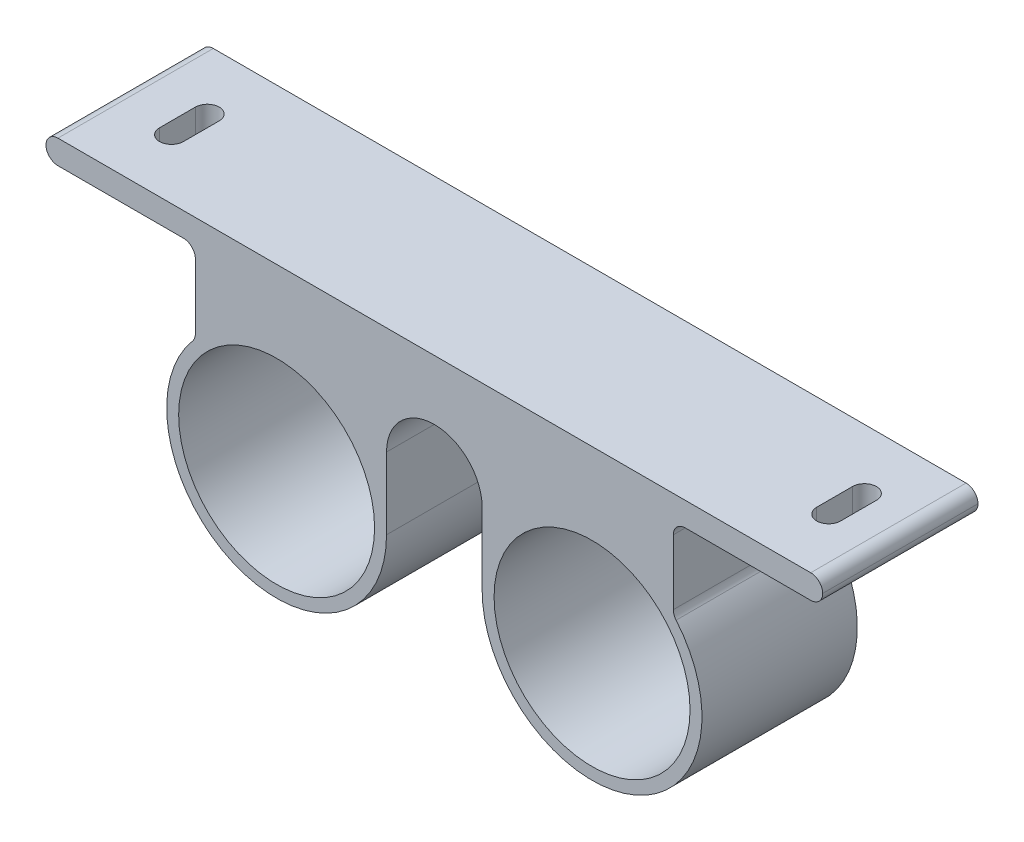
ISO-10303-21;
HEADER;
FILE_DESCRIPTION(('STEP AP214'),'2;1');
FILE_NAME('part.step','',(''),(''),'','','');
FILE_SCHEMA(('AUTOMOTIVE_DESIGN { 1 0 10303 214 1 1 1 1 }'));
ENDSEC;
DATA;
#1=APPLICATION_CONTEXT('core data for automotive mechanical design processes');
#2=APPLICATION_PROTOCOL_DEFINITION('international standard','automotive_design',2000,#1);
#3=PRODUCT_CONTEXT('',#1,'mechanical');
#4=PRODUCT('Part','Part','',(#3));
#5=PRODUCT_RELATED_PRODUCT_CATEGORY('part','',(#4));
#6=PRODUCT_DEFINITION_FORMATION('','',#4);
#7=PRODUCT_DEFINITION_CONTEXT('part definition',#1,'design');
#8=PRODUCT_DEFINITION('design','',#6,#7);
#9=PRODUCT_DEFINITION_SHAPE('','',#8);
#10=(LENGTH_UNIT() NAMED_UNIT(*) SI_UNIT(.MILLI.,.METRE.));
#11=(NAMED_UNIT(*) PLANE_ANGLE_UNIT() SI_UNIT($,.RADIAN.));
#12=(NAMED_UNIT(*) SI_UNIT($,.STERADIAN.) SOLID_ANGLE_UNIT());
#13=UNCERTAINTY_MEASURE_WITH_UNIT(LENGTH_MEASURE(1.E-05),#10,'distance_accuracy_value','');
#14=(GEOMETRIC_REPRESENTATION_CONTEXT(3) GLOBAL_UNCERTAINTY_ASSIGNED_CONTEXT((#13)) GLOBAL_UNIT_ASSIGNED_CONTEXT((#10,
#11,#12)) REPRESENTATION_CONTEXT('',''));
#15=CARTESIAN_POINT('',(0.,0.,0.));
#16=DIRECTION('',(0.,0.,1.));
#17=DIRECTION('',(1.,0.,0.));
#18=AXIS2_PLACEMENT_3D('',#15,#16,#17);
#19=CARTESIAN_POINT('',(9.3,10.,13.));
#20=DIRECTION('',(0.,0.,1.));
#21=DIRECTION('',(1.,0.,0.));
#22=AXIS2_PLACEMENT_3D('',#19,#20,#21);
#23=PLANE('',#22);
#24=CARTESIAN_POINT('',(35.7,10.,13.));
#25=DIRECTION('',(0.,0.,1.));
#26=DIRECTION('',(1.,0.,0.));
#27=AXIS2_PLACEMENT_3D('',#24,#25,#26);
#28=CIRCLE('',#27,8.2);
#29=CARTESIAN_POINT('',(27.5,10.,13.));
#30=VERTEX_POINT('',#29);
#31=EDGE_CURVE('E329',#30,#30,#28,.T.);
#32=ORIENTED_EDGE('',*,*,#31,.F.);
#33=EDGE_LOOP('',(#32));
#34=FACE_BOUND('',#33,.T.);
#35=DIRECTION('',(1.,0.,0.));
#36=VECTOR('',#35,1.);
#37=CARTESIAN_POINT('',(55.,23.,13.));
#38=LINE('',#37,#36);
#39=CARTESIAN_POINT('',(43.5,23.,13.));
#40=VERTEX_POINT('',#39);
#41=CARTESIAN_POINT('',(54.,23.,13.));
#42=VERTEX_POINT('',#41);
#43=EDGE_CURVE('E358',#40,#42,#38,.T.);
#44=ORIENTED_EDGE('',*,*,#43,.T.);
#45=CARTESIAN_POINT('',(54.,24.,13.));
#46=DIRECTION('',(0.,0.,1.));
#47=DIRECTION('',(1.,0.,0.));
#48=AXIS2_PLACEMENT_3D('',#45,#46,#47);
#49=CIRCLE('',#48,1.);
#50=CARTESIAN_POINT('',(55.,24.,13.));
#51=VERTEX_POINT('',#50);
#52=EDGE_CURVE('E457',#42,#51,#49,.T.);
#53=ORIENTED_EDGE('',*,*,#52,.T.);
#54=CARTESIAN_POINT('',(54.,24.,13.));
#55=DIRECTION('',(0.,0.,1.));
#56=DIRECTION('',(1.,0.,0.));
#57=AXIS2_PLACEMENT_3D('',#54,#55,#56);
#58=CIRCLE('',#57,1.);
#59=CARTESIAN_POINT('',(54.,25.,13.));
#60=VERTEX_POINT('',#59);
#61=EDGE_CURVE('E454',#51,#60,#58,.T.);
#62=ORIENTED_EDGE('',*,*,#61,.T.);
#63=DIRECTION('',(-1.,0.,0.));
#64=VECTOR('',#63,1.);
#65=CARTESIAN_POINT('',(55.,25.,13.));
#66=LINE('',#65,#64);
#67=CARTESIAN_POINT('',(-9.00000000000001,25.,13.));
#68=VERTEX_POINT('',#67);
#69=EDGE_CURVE('E362',#60,#68,#66,.T.);
#70=ORIENTED_EDGE('',*,*,#69,.T.);
#71=CARTESIAN_POINT('',(-9.,24.,13.));
#72=DIRECTION('',(0.,0.,1.));
#73=DIRECTION('',(1.,0.,0.));
#74=AXIS2_PLACEMENT_3D('',#71,#72,#73);
#75=CIRCLE('',#74,1.);
#76=CARTESIAN_POINT('',(-10.,24.,13.));
#77=VERTEX_POINT('',#76);
#78=EDGE_CURVE('E448',#68,#77,#75,.T.);
#79=ORIENTED_EDGE('',*,*,#78,.T.);
#80=CARTESIAN_POINT('',(-9.,24.,13.));
#81=DIRECTION('',(0.,0.,1.));
#82=DIRECTION('',(1.,0.,0.));
#83=AXIS2_PLACEMENT_3D('',#80,#81,#82);
#84=CIRCLE('',#83,1.);
#85=CARTESIAN_POINT('',(-9.,23.,13.));
#86=VERTEX_POINT('',#85);
#87=EDGE_CURVE('E451',#77,#86,#84,.T.);
#88=ORIENTED_EDGE('',*,*,#87,.T.);
#89=DIRECTION('',(1.,0.,0.));
#90=VECTOR('',#89,1.);
#91=CARTESIAN_POINT('',(-10.,23.,13.));
#92=LINE('',#91,#90);
#93=CARTESIAN_POINT('',(1.49999999999999,23.,13.));
#94=VERTEX_POINT('',#93);
#95=EDGE_CURVE('E366',#86,#94,#92,.T.);
#96=ORIENTED_EDGE('',*,*,#95,.T.);
#97=CARTESIAN_POINT('',(1.49999999999999,22.,13.));
#98=DIRECTION('',(0.,0.,1.));
#99=DIRECTION('',(1.,0.,0.));
#100=AXIS2_PLACEMENT_3D('',#97,#98,#99);
#101=CIRCLE('',#100,1.);
#102=CARTESIAN_POINT('',(2.49999999999999,22.,13.));
#103=VERTEX_POINT('',#102);
#104=EDGE_CURVE('E70',#94,#103,#101,.F.);
#105=ORIENTED_EDGE('',*,*,#104,.T.);
#106=DIRECTION('',(0.,-1.,0.));
#107=VECTOR('',#106,1.);
#108=CARTESIAN_POINT('',(2.49999999999999,23.,13.));
#109=LINE('',#108,#107);
#110=CARTESIAN_POINT('',(2.49999999999999,16.572670690062,13.));
#111=VERTEX_POINT('',#110);
#112=EDGE_CURVE('E369',#103,#111,#109,.T.);
#113=ORIENTED_EDGE('',*,*,#112,.T.);
#114=CARTESIAN_POINT('',(1.49999999999999,16.572670690062,13.));
#115=DIRECTION('',(0.,0.,1.));
#116=DIRECTION('',(1.,0.,0.));
#117=AXIS2_PLACEMENT_3D('',#114,#115,#116);
#118=CIRCLE('',#117,1.);
#119=CARTESIAN_POINT('',(2.26470588235294,15.9282912106441,13.));
#120=VERTEX_POINT('',#119);
#121=EDGE_CURVE('E11',#111,#120,#118,.F.);
#122=ORIENTED_EDGE('',*,*,#121,.T.);
#123=CARTESIAN_POINT('',(9.3,10.,13.));
#124=DIRECTION('',(0.,0.,1.));
#125=DIRECTION('',(1.,0.,0.));
#126=AXIS2_PLACEMENT_3D('',#123,#124,#125);
#127=CIRCLE('',#126,9.2);
#128=CARTESIAN_POINT('',(18.5,10.,13.));
#129=VERTEX_POINT('',#128);
#130=EDGE_CURVE('E337',#120,#129,#127,.T.);
#131=ORIENTED_EDGE('',*,*,#130,.T.);
#132=DIRECTION('',(0.,1.,0.));
#133=VECTOR('',#132,1.);
#134=CARTESIAN_POINT('',(18.5,10.,13.));
#135=LINE('',#134,#133);
#136=CARTESIAN_POINT('',(18.5,16.,13.));
#137=VERTEX_POINT('',#136);
#138=EDGE_CURVE('E340',#129,#137,#135,.T.);
#139=ORIENTED_EDGE('',*,*,#138,.T.);
#140=CARTESIAN_POINT('',(22.5,16.,13.));
#141=DIRECTION('',(0.,0.,-1.));
#142=DIRECTION('',(1.,0.,0.));
#143=AXIS2_PLACEMENT_3D('',#140,#141,#142);
#144=CIRCLE('',#143,4.);
#145=CARTESIAN_POINT('',(26.5,16.,13.));
#146=VERTEX_POINT('',#145);
#147=EDGE_CURVE('E344',#137,#146,#144,.T.);
#148=ORIENTED_EDGE('',*,*,#147,.T.);
#149=DIRECTION('',(0.,-1.,0.));
#150=VECTOR('',#149,1.);
#151=CARTESIAN_POINT('',(26.5,16.,13.));
#152=LINE('',#151,#150);
#153=CARTESIAN_POINT('',(26.5,10.,13.));
#154=VERTEX_POINT('',#153);
#155=EDGE_CURVE('E347',#146,#154,#152,.T.);
#156=ORIENTED_EDGE('',*,*,#155,.T.);
#157=CARTESIAN_POINT('',(35.7,10.,13.));
#158=DIRECTION('',(0.,0.,1.));
#159=DIRECTION('',(1.,0.,0.));
#160=AXIS2_PLACEMENT_3D('',#157,#158,#159);
#161=CIRCLE('',#160,9.19999999999999);
#162=CARTESIAN_POINT('',(42.7352941176471,15.9282912106441,13.));
#163=VERTEX_POINT('',#162);
#164=EDGE_CURVE('E350',#154,#163,#161,.T.);
#165=ORIENTED_EDGE('',*,*,#164,.T.);
#166=CARTESIAN_POINT('',(43.5,16.572670690062,13.));
#167=DIRECTION('',(0.,0.,1.));
#168=DIRECTION('',(1.,0.,0.));
#169=AXIS2_PLACEMENT_3D('',#166,#167,#168);
#170=CIRCLE('',#169,1.);
#171=CARTESIAN_POINT('',(42.5,16.572670690062,13.));
#172=VERTEX_POINT('',#171);
#173=EDGE_CURVE('E500',#163,#172,#170,.F.);
#174=ORIENTED_EDGE('',*,*,#173,.T.);
#175=DIRECTION('',(0.,1.,0.));
#176=VECTOR('',#175,1.);
#177=CARTESIAN_POINT('',(42.5,23.,13.));
#178=LINE('',#177,#176);
#179=CARTESIAN_POINT('',(42.5,22.,13.));
#180=VERTEX_POINT('',#179);
#181=EDGE_CURVE('E354',#172,#180,#178,.T.);
#182=ORIENTED_EDGE('',*,*,#181,.T.);
#183=CARTESIAN_POINT('',(43.5,22.,13.));
#184=DIRECTION('',(0.,0.,1.));
#185=DIRECTION('',(1.,0.,0.));
#186=AXIS2_PLACEMENT_3D('',#183,#184,#185);
#187=CIRCLE('',#186,1.);
#188=EDGE_CURVE('E489',#180,#40,#187,.F.);
#189=ORIENTED_EDGE('',*,*,#188,.T.);
#190=EDGE_LOOP('',(#44,#53,#62,#70,#79,#88,#96,#105,#113,#122,#131,#139,#148,#156,#165,#174,
#182,#189));
#191=FACE_BOUND('',#190,.T.);
#192=CARTESIAN_POINT('',(9.3,10.,13.));
#193=DIRECTION('',(0.,0.,1.));
#194=DIRECTION('',(1.,0.,0.));
#195=AXIS2_PLACEMENT_3D('',#192,#193,#194);
#196=CIRCLE('',#195,8.2);
#197=CARTESIAN_POINT('',(1.1,10.,13.));
#198=VERTEX_POINT('',#197);
#199=EDGE_CURVE('E321',#198,#198,#196,.T.);
#200=ORIENTED_EDGE('',*,*,#199,.F.);
#201=EDGE_LOOP('',(#200));
#202=FACE_BOUND('',#201,.T.);
#203=ADVANCED_FACE('F45',(#34,#191,#202),#23,.T.);
#204=CARTESIAN_POINT('',(9.3,10.,0.));
#205=DIRECTION('',(0.,0.,1.));
#206=DIRECTION('',(1.,0.,0.));
#207=AXIS2_PLACEMENT_3D('',#204,#205,#206);
#208=PLANE('',#207);
#209=CARTESIAN_POINT('',(54.,24.,0.));
#210=DIRECTION('',(0.,0.,1.));
#211=DIRECTION('',(1.,0.,0.));
#212=AXIS2_PLACEMENT_3D('',#209,#210,#211);
#213=CIRCLE('',#212,1.);
#214=CARTESIAN_POINT('',(54.,25.,0.));
#215=VERTEX_POINT('',#214);
#216=CARTESIAN_POINT('',(55.,24.,0.));
#217=VERTEX_POINT('',#216);
#218=EDGE_CURVE('E442',#215,#217,#213,.F.);
#219=ORIENTED_EDGE('',*,*,#218,.T.);
#220=CARTESIAN_POINT('',(54.,24.,0.));
#221=DIRECTION('',(0.,0.,1.));
#222=DIRECTION('',(1.,0.,0.));
#223=AXIS2_PLACEMENT_3D('',#220,#221,#222);
#224=CIRCLE('',#223,1.);
#225=CARTESIAN_POINT('',(54.,23.,0.));
#226=VERTEX_POINT('',#225);
#227=EDGE_CURVE('E445',#217,#226,#224,.F.);
#228=ORIENTED_EDGE('',*,*,#227,.T.);
#229=DIRECTION('',(1.,0.,0.));
#230=VECTOR('',#229,1.);
#231=CARTESIAN_POINT('',(55.,23.,0.));
#232=LINE('',#231,#230);
#233=CARTESIAN_POINT('',(43.5,23.,0.));
#234=VERTEX_POINT('',#233);
#235=EDGE_CURVE('E392',#234,#226,#232,.T.);
#236=ORIENTED_EDGE('',*,*,#235,.F.);
#237=CARTESIAN_POINT('',(43.5,22.,0.));
#238=DIRECTION('',(0.,0.,1.));
#239=DIRECTION('',(1.,0.,0.));
#240=AXIS2_PLACEMENT_3D('',#237,#238,#239);
#241=CIRCLE('',#240,1.);
#242=CARTESIAN_POINT('',(42.5,22.,0.));
#243=VERTEX_POINT('',#242);
#244=EDGE_CURVE('E486',#234,#243,#241,.T.);
#245=ORIENTED_EDGE('',*,*,#244,.T.);
#246=DIRECTION('',(0.,1.,0.));
#247=VECTOR('',#246,1.);
#248=CARTESIAN_POINT('',(42.5,23.,0.));
#249=LINE('',#248,#247);
#250=CARTESIAN_POINT('',(42.5,16.572670690062,0.));
#251=VERTEX_POINT('',#250);
#252=EDGE_CURVE('E388',#251,#243,#249,.T.);
#253=ORIENTED_EDGE('',*,*,#252,.F.);
#254=CARTESIAN_POINT('',(43.5,16.572670690062,0.));
#255=DIRECTION('',(0.,0.,1.));
#256=DIRECTION('',(1.,0.,0.));
#257=AXIS2_PLACEMENT_3D('',#254,#255,#256);
#258=CIRCLE('',#257,1.);
#259=CARTESIAN_POINT('',(42.7352941176471,15.9282912106441,0.));
#260=VERTEX_POINT('',#259);
#261=EDGE_CURVE('E497',#251,#260,#258,.T.);
#262=ORIENTED_EDGE('',*,*,#261,.T.);
#263=CARTESIAN_POINT('',(35.7,10.,0.));
#264=DIRECTION('',(0.,0.,1.));
#265=DIRECTION('',(1.,0.,0.));
#266=AXIS2_PLACEMENT_3D('',#263,#264,#265);
#267=CIRCLE('',#266,9.19999999999999);
#268=CARTESIAN_POINT('',(26.5,10.,0.));
#269=VERTEX_POINT('',#268);
#270=EDGE_CURVE('E384',#269,#260,#267,.T.);
#271=ORIENTED_EDGE('',*,*,#270,.F.);
#272=DIRECTION('',(0.,-1.,0.));
#273=VECTOR('',#272,1.);
#274=CARTESIAN_POINT('',(26.5,16.,0.));
#275=LINE('',#274,#273);
#276=CARTESIAN_POINT('',(26.5,16.,0.));
#277=VERTEX_POINT('',#276);
#278=EDGE_CURVE('E381',#277,#269,#275,.T.);
#279=ORIENTED_EDGE('',*,*,#278,.F.);
#280=CARTESIAN_POINT('',(22.5,16.,0.));
#281=DIRECTION('',(0.,0.,-1.));
#282=DIRECTION('',(1.,0.,0.));
#283=AXIS2_PLACEMENT_3D('',#280,#281,#282);
#284=CIRCLE('',#283,4.);
#285=CARTESIAN_POINT('',(18.5,16.,0.));
#286=VERTEX_POINT('',#285);
#287=EDGE_CURVE('E378',#286,#277,#284,.T.);
#288=ORIENTED_EDGE('',*,*,#287,.F.);
#289=DIRECTION('',(0.,1.,0.));
#290=VECTOR('',#289,1.);
#291=CARTESIAN_POINT('',(18.5,10.,0.));
#292=LINE('',#291,#290);
#293=CARTESIAN_POINT('',(18.5,10.,0.));
#294=VERTEX_POINT('',#293);
#295=EDGE_CURVE('E375',#294,#286,#292,.T.);
#296=ORIENTED_EDGE('',*,*,#295,.F.);
#297=CARTESIAN_POINT('',(9.3,10.,0.));
#298=DIRECTION('',(0.,0.,1.));
#299=DIRECTION('',(1.,0.,0.));
#300=AXIS2_PLACEMENT_3D('',#297,#298,#299);
#301=CIRCLE('',#300,9.2);
#302=CARTESIAN_POINT('',(2.26470588235294,15.9282912106441,0.));
#303=VERTEX_POINT('',#302);
#304=EDGE_CURVE('E333',#303,#294,#301,.T.);
#305=ORIENTED_EDGE('',*,*,#304,.F.);
#306=CARTESIAN_POINT('',(1.49999999999999,16.572670690062,0.));
#307=DIRECTION('',(0.,0.,1.));
#308=DIRECTION('',(1.,0.,0.));
#309=AXIS2_PLACEMENT_3D('',#306,#307,#308);
#310=CIRCLE('',#309,1.);
#311=CARTESIAN_POINT('',(2.49999999999999,16.572670690062,0.));
#312=VERTEX_POINT('',#311);
#313=EDGE_CURVE('E55',#303,#312,#310,.T.);
#314=ORIENTED_EDGE('',*,*,#313,.T.);
#315=DIRECTION('',(0.,-1.,0.));
#316=VECTOR('',#315,1.);
#317=CARTESIAN_POINT('',(2.49999999999999,23.,0.));
#318=LINE('',#317,#316);
#319=CARTESIAN_POINT('',(2.49999999999999,22.,0.));
#320=VERTEX_POINT('',#319);
#321=EDGE_CURVE('E341',#320,#312,#318,.T.);
#322=ORIENTED_EDGE('',*,*,#321,.F.);
#323=CARTESIAN_POINT('',(1.49999999999999,22.,0.));
#324=DIRECTION('',(0.,0.,1.));
#325=DIRECTION('',(1.,0.,0.));
#326=AXIS2_PLACEMENT_3D('',#323,#324,#325);
#327=CIRCLE('',#326,1.);
#328=CARTESIAN_POINT('',(1.49999999999999,23.,0.));
#329=VERTEX_POINT('',#328);
#330=EDGE_CURVE('E492',#320,#329,#327,.T.);
#331=ORIENTED_EDGE('',*,*,#330,.T.);
#332=DIRECTION('',(1.,0.,0.));
#333=VECTOR('',#332,1.);
#334=CARTESIAN_POINT('',(-10.,23.,0.));
#335=LINE('',#334,#333);
#336=CARTESIAN_POINT('',(-9.,23.,0.));
#337=VERTEX_POINT('',#336);
#338=EDGE_CURVE('E400',#337,#329,#335,.T.);
#339=ORIENTED_EDGE('',*,*,#338,.F.);
#340=CARTESIAN_POINT('',(-9.,24.,0.));
#341=DIRECTION('',(0.,0.,1.));
#342=DIRECTION('',(1.,0.,0.));
#343=AXIS2_PLACEMENT_3D('',#340,#341,#342);
#344=CIRCLE('',#343,1.);
#345=CARTESIAN_POINT('',(-10.,24.,0.));
#346=VERTEX_POINT('',#345);
#347=EDGE_CURVE('E439',#337,#346,#344,.F.);
#348=ORIENTED_EDGE('',*,*,#347,.T.);
#349=CARTESIAN_POINT('',(-9.,24.,0.));
#350=DIRECTION('',(0.,0.,1.));
#351=DIRECTION('',(1.,0.,0.));
#352=AXIS2_PLACEMENT_3D('',#349,#350,#351);
#353=CIRCLE('',#352,1.);
#354=CARTESIAN_POINT('',(-9.00000000000001,25.,0.));
#355=VERTEX_POINT('',#354);
#356=EDGE_CURVE('E436',#346,#355,#353,.F.);
#357=ORIENTED_EDGE('',*,*,#356,.T.);
#358=DIRECTION('',(-1.,0.,0.));
#359=VECTOR('',#358,1.);
#360=CARTESIAN_POINT('',(55.,25.,0.));
#361=LINE('',#360,#359);
#362=EDGE_CURVE('E396',#215,#355,#361,.T.);
#363=ORIENTED_EDGE('',*,*,#362,.F.);
#364=EDGE_LOOP('',(#219,#228,#236,#245,#253,#262,#271,#279,#288,#296,#305,#314,#322,#331,#339,
#348,#357,#363));
#365=FACE_BOUND('',#364,.T.);
#366=CARTESIAN_POINT('',(35.7,10.,0.));
#367=DIRECTION('',(0.,0.,1.));
#368=DIRECTION('',(1.,0.,0.));
#369=AXIS2_PLACEMENT_3D('',#366,#367,#368);
#370=CIRCLE('',#369,8.2);
#371=CARTESIAN_POINT('',(27.5,10.,0.));
#372=VERTEX_POINT('',#371);
#373=EDGE_CURVE('E325',#372,#372,#370,.T.);
#374=ORIENTED_EDGE('',*,*,#373,.T.);
#375=EDGE_LOOP('',(#374));
#376=FACE_BOUND('',#375,.T.);
#377=CARTESIAN_POINT('',(9.3,10.,0.));
#378=DIRECTION('',(0.,0.,1.));
#379=DIRECTION('',(1.,0.,0.));
#380=AXIS2_PLACEMENT_3D('',#377,#378,#379);
#381=CIRCLE('',#380,8.2);
#382=CARTESIAN_POINT('',(1.1,10.,0.));
#383=VERTEX_POINT('',#382);
#384=EDGE_CURVE('E244',#383,#383,#381,.T.);
#385=ORIENTED_EDGE('',*,*,#384,.T.);
#386=EDGE_LOOP('',(#385));
#387=FACE_BOUND('',#386,.T.);
#388=ADVANCED_FACE('F523',(#365,#376,#387),#208,.F.);
#389=CARTESIAN_POINT('',(9.3,10.,13.));
#390=DIRECTION('',(0.,0.,-1.));
#391=DIRECTION('',(-1.,0.,0.));
#392=AXIS2_PLACEMENT_3D('',#389,#390,#391);
#393=CYLINDRICAL_SURFACE('',#392,9.2);
#394=ORIENTED_EDGE('',*,*,#130,.F.);
#395=DIRECTION('',(0.,0.,-1.));
#396=VECTOR('',#395,1.);
#397=CARTESIAN_POINT('',(2.26470588235294,15.9282912106441,13.));
#398=LINE('',#397,#396);
#399=EDGE_CURVE('E482',#120,#303,#398,.T.);
#400=ORIENTED_EDGE('',*,*,#399,.T.);
#401=ORIENTED_EDGE('',*,*,#304,.T.);
#402=DIRECTION('',(0.,0.,-1.));
#403=VECTOR('',#402,1.);
#404=CARTESIAN_POINT('',(18.5,10.,13.));
#405=LINE('',#404,#403);
#406=EDGE_CURVE('E417',#129,#294,#405,.T.);
#407=ORIENTED_EDGE('',*,*,#406,.F.);
#408=EDGE_LOOP('',(#394,#400,#401,#407));
#409=FACE_BOUND('',#408,.T.);
#410=ADVANCED_FACE('F578',(#409),#393,.T.);
#411=CARTESIAN_POINT('',(18.5,10.,13.));
#412=DIRECTION('',(-1.,0.,0.));
#413=DIRECTION('',(0.,0.,1.));
#414=AXIS2_PLACEMENT_3D('',#411,#412,#413);
#415=PLANE('',#414);
#416=ORIENTED_EDGE('',*,*,#295,.T.);
#417=DIRECTION('',(0.,0.,-1.));
#418=VECTOR('',#417,1.);
#419=CARTESIAN_POINT('',(18.5,16.,13.));
#420=LINE('',#419,#418);
#421=EDGE_CURVE('E413',#137,#286,#420,.T.);
#422=ORIENTED_EDGE('',*,*,#421,.F.);
#423=ORIENTED_EDGE('',*,*,#138,.F.);
#424=ORIENTED_EDGE('',*,*,#406,.T.);
#425=EDGE_LOOP('',(#416,#422,#423,#424));
#426=FACE_BOUND('',#425,.T.);
#427=ADVANCED_FACE('F574',(#426),#415,.F.);
#428=CARTESIAN_POINT('',(22.5,16.,13.));
#429=DIRECTION('',(0.,0.,-1.));
#430=DIRECTION('',(-1.,0.,0.));
#431=AXIS2_PLACEMENT_3D('',#428,#429,#430);
#432=CYLINDRICAL_SURFACE('',#431,4.);
#433=ORIENTED_EDGE('',*,*,#287,.T.);
#434=DIRECTION('',(0.,0.,-1.));
#435=VECTOR('',#434,1.);
#436=CARTESIAN_POINT('',(26.5,16.,13.));
#437=LINE('',#436,#435);
#438=EDGE_CURVE('E409',#146,#277,#437,.T.);
#439=ORIENTED_EDGE('',*,*,#438,.F.);
#440=ORIENTED_EDGE('',*,*,#147,.F.);
#441=ORIENTED_EDGE('',*,*,#421,.T.);
#442=EDGE_LOOP('',(#433,#439,#440,#441));
#443=FACE_BOUND('',#442,.T.);
#444=ADVANCED_FACE('F569',(#443),#432,.F.);
#445=CARTESIAN_POINT('',(26.5,16.,13.));
#446=DIRECTION('',(1.,0.,0.));
#447=DIRECTION('',(0.,1.,0.));
#448=AXIS2_PLACEMENT_3D('',#445,#446,#447);
#449=PLANE('',#448);
#450=ORIENTED_EDGE('',*,*,#278,.T.);
#451=DIRECTION('',(0.,0.,-1.));
#452=VECTOR('',#451,1.);
#453=CARTESIAN_POINT('',(26.5,10.,13.));
#454=LINE('',#453,#452);
#455=EDGE_CURVE('E372',#154,#269,#454,.T.);
#456=ORIENTED_EDGE('',*,*,#455,.F.);
#457=ORIENTED_EDGE('',*,*,#155,.F.);
#458=ORIENTED_EDGE('',*,*,#438,.T.);
#459=EDGE_LOOP('',(#450,#456,#457,#458));
#460=FACE_BOUND('',#459,.T.);
#461=ADVANCED_FACE('F563',(#460),#449,.F.);
#462=CARTESIAN_POINT('',(35.7,10.,13.));
#463=DIRECTION('',(0.,0.,-1.));
#464=DIRECTION('',(-1.,0.,0.));
#465=AXIS2_PLACEMENT_3D('',#462,#463,#464);
#466=CYLINDRICAL_SURFACE('',#465,9.19999999999999);
#467=ORIENTED_EDGE('',*,*,#270,.T.);
#468=DIRECTION('',(0.,0.,-1.));
#469=VECTOR('',#468,1.);
#470=CARTESIAN_POINT('',(42.7352941176471,15.9282912106441,13.));
#471=LINE('',#470,#469);
#472=EDGE_CURVE('E479',#260,#163,#471,.F.);
#473=ORIENTED_EDGE('',*,*,#472,.T.);
#474=ORIENTED_EDGE('',*,*,#164,.F.);
#475=ORIENTED_EDGE('',*,*,#455,.T.);
#476=EDGE_LOOP('',(#467,#473,#474,#475));
#477=FACE_BOUND('',#476,.T.);
#478=ADVANCED_FACE('F558',(#477),#466,.T.);
#479=CARTESIAN_POINT('',(42.5,23.,13.));
#480=DIRECTION('',(-1.,0.,0.));
#481=DIRECTION('',(0.,-1.,0.));
#482=AXIS2_PLACEMENT_3D('',#479,#480,#481);
#483=PLANE('',#482);
#484=ORIENTED_EDGE('',*,*,#252,.T.);
#485=DIRECTION('',(0.,0.,-1.));
#486=VECTOR('',#485,1.);
#487=CARTESIAN_POINT('',(42.5,22.,13.));
#488=LINE('',#487,#486);
#489=EDGE_CURVE('E433',#243,#180,#488,.F.);
#490=ORIENTED_EDGE('',*,*,#489,.T.);
#491=ORIENTED_EDGE('',*,*,#181,.F.);
#492=DIRECTION('',(0.,0.,1.));
#493=VECTOR('',#492,1.);
#494=CARTESIAN_POINT('',(42.5,16.572670690062,0.));
#495=LINE('',#494,#493);
#496=EDGE_CURVE('E429',#172,#251,#495,.F.);
#497=ORIENTED_EDGE('',*,*,#496,.T.);
#498=EDGE_LOOP('',(#484,#490,#491,#497));
#499=FACE_BOUND('',#498,.T.);
#500=ADVANCED_FACE('F548',(#499),#483,.F.);
#501=CARTESIAN_POINT('',(55.,23.,13.));
#502=DIRECTION('',(0.,1.,0.));
#503=DIRECTION('',(0.,0.,1.));
#504=AXIS2_PLACEMENT_3D('',#501,#502,#503);
#505=PLANE('',#504);
#506=DIRECTION('',(0.,0.,1.));
#507=VECTOR('',#506,1.);
#508=CARTESIAN_POINT('',(51.5,23.,5.));
#509=LINE('',#508,#507);
#510=CARTESIAN_POINT('',(51.5,23.,5.));
#511=VERTEX_POINT('',#510);
#512=CARTESIAN_POINT('',(51.5,23.,8.));
#513=VERTEX_POINT('',#512);
#514=EDGE_CURVE('E314',#511,#513,#509,.T.);
#515=ORIENTED_EDGE('',*,*,#514,.F.);
#516=CARTESIAN_POINT('',(50.5,23.,5.));
#517=DIRECTION('',(0.,1.,0.));
#518=DIRECTION('',(0.,0.,1.));
#519=AXIS2_PLACEMENT_3D('',#516,#517,#518);
#520=CIRCLE('',#519,1.);
#521=CARTESIAN_POINT('',(49.5,23.,5.));
#522=VERTEX_POINT('',#521);
#523=EDGE_CURVE('E310',#522,#511,#520,.F.);
#524=ORIENTED_EDGE('',*,*,#523,.F.);
#525=DIRECTION('',(0.,0.,-1.));
#526=VECTOR('',#525,1.);
#527=CARTESIAN_POINT('',(49.5,23.,5.));
#528=LINE('',#527,#526);
#529=CARTESIAN_POINT('',(49.5,23.,8.));
#530=VERTEX_POINT('',#529);
#531=EDGE_CURVE('E277',#530,#522,#528,.T.);
#532=ORIENTED_EDGE('',*,*,#531,.F.);
#533=CARTESIAN_POINT('',(50.5,23.,8.));
#534=DIRECTION('',(0.,1.,0.));
#535=DIRECTION('',(0.,0.,1.));
#536=AXIS2_PLACEMENT_3D('',#533,#534,#535);
#537=CIRCLE('',#536,1.);
#538=EDGE_CURVE('E318',#513,#530,#537,.F.);
#539=ORIENTED_EDGE('',*,*,#538,.F.);
#540=EDGE_LOOP('',(#515,#524,#532,#539));
#541=FACE_BOUND('',#540,.T.);
#542=ORIENTED_EDGE('',*,*,#43,.F.);
#543=DIRECTION('',(0.,0.,-1.));
#544=VECTOR('',#543,1.);
#545=CARTESIAN_POINT('',(43.5,23.,0.));
#546=LINE('',#545,#544);
#547=EDGE_CURVE('E425',#40,#234,#546,.T.);
#548=ORIENTED_EDGE('',*,*,#547,.T.);
#549=ORIENTED_EDGE('',*,*,#235,.T.);
#550=DIRECTION('',(0.,0.,-1.));
#551=VECTOR('',#550,1.);
#552=CARTESIAN_POINT('',(54.,23.,13.));
#553=LINE('',#552,#551);
#554=EDGE_CURVE('E421',#226,#42,#553,.F.);
#555=ORIENTED_EDGE('',*,*,#554,.T.);
#556=EDGE_LOOP('',(#542,#548,#549,#555));
#557=FACE_BOUND('',#556,.T.);
#558=ADVANCED_FACE('F538',(#541,#557),#505,.F.);
#559=CARTESIAN_POINT('',(55.,25.,13.));
#560=DIRECTION('',(0.,-1.,0.));
#561=DIRECTION('',(0.,0.,-1.));
#562=AXIS2_PLACEMENT_3D('',#559,#560,#561);
#563=PLANE('',#562);
#564=DIRECTION('',(0.,0.,1.));
#565=VECTOR('',#564,1.);
#566=CARTESIAN_POINT('',(-5.5,25.,5.));
#567=LINE('',#566,#565);
#568=CARTESIAN_POINT('',(-5.50000000000001,25.,5.));
#569=VERTEX_POINT('',#568);
#570=CARTESIAN_POINT('',(-5.5,25.,8.));
#571=VERTEX_POINT('',#570);
#572=EDGE_CURVE('E255',#569,#571,#567,.T.);
#573=ORIENTED_EDGE('',*,*,#572,.F.);
#574=CARTESIAN_POINT('',(-4.5,25.,5.));
#575=DIRECTION('',(0.,1.,0.));
#576=DIRECTION('',(0.,0.,1.));
#577=AXIS2_PLACEMENT_3D('',#574,#575,#576);
#578=CIRCLE('',#577,1.);
#579=CARTESIAN_POINT('',(-3.49999999999999,25.,5.));
#580=VERTEX_POINT('',#579);
#581=EDGE_CURVE('E229',#580,#569,#578,.T.);
#582=ORIENTED_EDGE('',*,*,#581,.F.);
#583=DIRECTION('',(0.,0.,-1.));
#584=VECTOR('',#583,1.);
#585=CARTESIAN_POINT('',(-3.49999999999999,25.,5.));
#586=LINE('',#585,#584);
#587=CARTESIAN_POINT('',(-3.49999999999999,25.,8.));
#588=VERTEX_POINT('',#587);
#589=EDGE_CURVE('E235',#588,#580,#586,.T.);
#590=ORIENTED_EDGE('',*,*,#589,.F.);
#591=CARTESIAN_POINT('',(-4.5,25.,8.));
#592=DIRECTION('',(0.,1.,0.));
#593=DIRECTION('',(0.,0.,1.));
#594=AXIS2_PLACEMENT_3D('',#591,#592,#593);
#595=CIRCLE('',#594,1.);
#596=EDGE_CURVE('E263',#571,#588,#595,.T.);
#597=ORIENTED_EDGE('',*,*,#596,.F.);
#598=EDGE_LOOP('',(#573,#582,#590,#597));
#599=FACE_BOUND('',#598,.T.);
#600=DIRECTION('',(0.,0.,1.));
#601=VECTOR('',#600,1.);
#602=CARTESIAN_POINT('',(49.5,25.,5.));
#603=LINE('',#602,#601);
#604=CARTESIAN_POINT('',(49.5,25.,5.));
#605=VERTEX_POINT('',#604);
#606=CARTESIAN_POINT('',(49.5,25.,8.));
#607=VERTEX_POINT('',#606);
#608=EDGE_CURVE('E303',#605,#607,#603,.T.);
#609=ORIENTED_EDGE('',*,*,#608,.F.);
#610=CARTESIAN_POINT('',(50.5,25.,5.));
#611=DIRECTION('',(0.,1.,0.));
#612=DIRECTION('',(0.,0.,1.));
#613=AXIS2_PLACEMENT_3D('',#610,#611,#612);
#614=CIRCLE('',#613,1.);
#615=CARTESIAN_POINT('',(51.5,25.,5.));
#616=VERTEX_POINT('',#615);
#617=EDGE_CURVE('E307',#616,#605,#614,.T.);
#618=ORIENTED_EDGE('',*,*,#617,.F.);
#619=DIRECTION('',(0.,0.,-1.));
#620=VECTOR('',#619,1.);
#621=CARTESIAN_POINT('',(51.5,25.,5.));
#622=LINE('',#621,#620);
#623=CARTESIAN_POINT('',(51.5,25.,8.));
#624=VERTEX_POINT('',#623);
#625=EDGE_CURVE('E287',#624,#616,#622,.T.);
#626=ORIENTED_EDGE('',*,*,#625,.F.);
#627=CARTESIAN_POINT('',(50.5,25.,8.));
#628=DIRECTION('',(0.,1.,0.));
#629=DIRECTION('',(0.,0.,1.));
#630=AXIS2_PLACEMENT_3D('',#627,#628,#629);
#631=CIRCLE('',#630,1.);
#632=EDGE_CURVE('E299',#607,#624,#631,.T.);
#633=ORIENTED_EDGE('',*,*,#632,.F.);
#634=EDGE_LOOP('',(#609,#618,#626,#633));
#635=FACE_BOUND('',#634,.T.);
#636=ORIENTED_EDGE('',*,*,#69,.F.);
#637=DIRECTION('',(0.,0.,-1.));
#638=VECTOR('',#637,1.);
#639=CARTESIAN_POINT('',(54.,25.,13.));
#640=LINE('',#639,#638);
#641=EDGE_CURVE('E476',#60,#215,#640,.T.);
#642=ORIENTED_EDGE('',*,*,#641,.T.);
#643=ORIENTED_EDGE('',*,*,#362,.T.);
#644=DIRECTION('',(0.,0.,-1.));
#645=VECTOR('',#644,1.);
#646=CARTESIAN_POINT('',(-9.00000000000001,25.,13.));
#647=LINE('',#646,#645);
#648=EDGE_CURVE('E473',#355,#68,#647,.F.);
#649=ORIENTED_EDGE('',*,*,#648,.T.);
#650=EDGE_LOOP('',(#636,#642,#643,#649));
#651=FACE_BOUND('',#650,.T.);
#652=ADVANCED_FACE('F529',(#599,#635,#651),#563,.F.);
#653=CARTESIAN_POINT('',(-10.,23.,13.));
#654=DIRECTION('',(0.,1.,0.));
#655=DIRECTION('',(0.,0.,1.));
#656=AXIS2_PLACEMENT_3D('',#653,#654,#655);
#657=PLANE('',#656);
#658=DIRECTION('',(0.,0.,1.));
#659=VECTOR('',#658,1.);
#660=CARTESIAN_POINT('',(-3.49999999999999,23.,5.));
#661=LINE('',#660,#659);
#662=CARTESIAN_POINT('',(-3.49999999999999,23.,5.));
#663=VERTEX_POINT('',#662);
#664=CARTESIAN_POINT('',(-3.49999999999999,23.,8.));
#665=VERTEX_POINT('',#664);
#666=EDGE_CURVE('E250',#663,#665,#661,.T.);
#667=ORIENTED_EDGE('',*,*,#666,.F.);
#668=CARTESIAN_POINT('',(-4.5,23.,5.));
#669=DIRECTION('',(0.,1.,0.));
#670=DIRECTION('',(0.,0.,1.));
#671=AXIS2_PLACEMENT_3D('',#668,#669,#670);
#672=CIRCLE('',#671,1.);
#673=CARTESIAN_POINT('',(-5.5,23.,5.));
#674=VERTEX_POINT('',#673);
#675=EDGE_CURVE('E226',#674,#663,#672,.F.);
#676=ORIENTED_EDGE('',*,*,#675,.F.);
#677=DIRECTION('',(0.,0.,-1.));
#678=VECTOR('',#677,1.);
#679=CARTESIAN_POINT('',(-5.5,23.,5.));
#680=LINE('',#679,#678);
#681=CARTESIAN_POINT('',(-5.5,23.,8.));
#682=VERTEX_POINT('',#681);
#683=EDGE_CURVE('E239',#682,#674,#680,.T.);
#684=ORIENTED_EDGE('',*,*,#683,.F.);
#685=CARTESIAN_POINT('',(-4.5,23.,8.));
#686=DIRECTION('',(0.,1.,0.));
#687=DIRECTION('',(0.,0.,1.));
#688=AXIS2_PLACEMENT_3D('',#685,#686,#687);
#689=CIRCLE('',#688,1.);
#690=EDGE_CURVE('E257',#665,#682,#689,.F.);
#691=ORIENTED_EDGE('',*,*,#690,.F.);
#692=EDGE_LOOP('',(#667,#676,#684,#691));
#693=FACE_BOUND('',#692,.T.);
#694=ORIENTED_EDGE('',*,*,#338,.T.);
#695=DIRECTION('',(0.,0.,-1.));
#696=VECTOR('',#695,1.);
#697=CARTESIAN_POINT('',(1.49999999999999,23.,13.));
#698=LINE('',#697,#696);
#699=EDGE_CURVE('E470',#329,#94,#698,.F.);
#700=ORIENTED_EDGE('',*,*,#699,.T.);
#701=ORIENTED_EDGE('',*,*,#95,.F.);
#702=DIRECTION('',(0.,0.,-1.));
#703=VECTOR('',#702,1.);
#704=CARTESIAN_POINT('',(-9.,23.,13.));
#705=LINE('',#704,#703);
#706=EDGE_CURVE('E466',#86,#337,#705,.T.);
#707=ORIENTED_EDGE('',*,*,#706,.T.);
#708=EDGE_LOOP('',(#694,#700,#701,#707));
#709=FACE_BOUND('',#708,.T.);
#710=ADVANCED_FACE('F247',(#693,#709),#657,.F.);
#711=CARTESIAN_POINT('',(2.49999999999999,23.,13.));
#712=DIRECTION('',(1.,0.,0.));
#713=DIRECTION('',(0.,1.,0.));
#714=AXIS2_PLACEMENT_3D('',#711,#712,#713);
#715=PLANE('',#714);
#716=ORIENTED_EDGE('',*,*,#112,.F.);
#717=DIRECTION('',(0.,0.,-1.));
#718=VECTOR('',#717,1.);
#719=CARTESIAN_POINT('',(2.49999999999999,22.,0.));
#720=LINE('',#719,#718);
#721=EDGE_CURVE('E462',#103,#320,#720,.T.);
#722=ORIENTED_EDGE('',*,*,#721,.T.);
#723=ORIENTED_EDGE('',*,*,#321,.T.);
#724=DIRECTION('',(0.,0.,1.));
#725=VECTOR('',#724,1.);
#726=CARTESIAN_POINT('',(2.49999999999999,16.572670690062,13.));
#727=LINE('',#726,#725);
#728=EDGE_CURVE('E63',#312,#111,#727,.T.);
#729=ORIENTED_EDGE('',*,*,#728,.T.);
#730=EDGE_LOOP('',(#716,#722,#723,#729));
#731=FACE_BOUND('',#730,.T.);
#732=ADVANCED_FACE('F582',(#731),#715,.F.);
#733=CARTESIAN_POINT('',(35.7,10.,13.));
#734=DIRECTION('',(0.,0.,-1.));
#735=DIRECTION('',(-1.,0.,0.));
#736=AXIS2_PLACEMENT_3D('',#733,#734,#735);
#737=CYLINDRICAL_SURFACE('',#736,8.2);
#738=CARTESIAN_POINT('',(27.5,10.,13.));
#739=CARTESIAN_POINT('',(27.5,10.,12.8645833333333));
#740=CARTESIAN_POINT('',(27.5,10.,12.7291666666667));
#741=CARTESIAN_POINT('',(27.5,10.,12.4583333333333));
#742=CARTESIAN_POINT('',(27.5,10.,12.3229166666667));
#743=CARTESIAN_POINT('',(27.5,10.,12.0520833333333));
#744=CARTESIAN_POINT('',(27.5,10.,11.9166666666667));
#745=CARTESIAN_POINT('',(27.5,10.,11.6458333333333));
#746=CARTESIAN_POINT('',(27.5,10.,11.5104166666667));
#747=CARTESIAN_POINT('',(27.5,10.,11.2395833333333));
#748=CARTESIAN_POINT('',(27.5,10.,11.1041666666667));
#749=CARTESIAN_POINT('',(27.5,10.,10.8333333333333));
#750=CARTESIAN_POINT('',(27.5,10.,10.6979166666667));
#751=CARTESIAN_POINT('',(27.5,10.,10.4270833333333));
#752=CARTESIAN_POINT('',(27.5,10.,10.2916666666667));
#753=CARTESIAN_POINT('',(27.5,10.,10.0208333333333));
#754=CARTESIAN_POINT('',(27.5,10.,9.88541666666667));
#755=CARTESIAN_POINT('',(27.5,10.,9.61458333333333));
#756=CARTESIAN_POINT('',(27.5,10.,9.47916666666667));
#757=CARTESIAN_POINT('',(27.5,10.,9.20833333333333));
#758=CARTESIAN_POINT('',(27.5,10.,9.07291666666666));
#759=CARTESIAN_POINT('',(27.5,10.,8.80208333333333));
#760=CARTESIAN_POINT('',(27.5,10.,8.66666666666667));
#761=CARTESIAN_POINT('',(27.5,10.,8.39583333333333));
#762=CARTESIAN_POINT('',(27.5,10.,8.26041666666667));
#763=CARTESIAN_POINT('',(27.5,10.,7.98958333333333));
#764=CARTESIAN_POINT('',(27.5,10.,7.85416666666667));
#765=CARTESIAN_POINT('',(27.5,10.,7.58333333333333));
#766=CARTESIAN_POINT('',(27.5,10.,7.44791666666667));
#767=CARTESIAN_POINT('',(27.5,10.,7.17708333333333));
#768=CARTESIAN_POINT('',(27.5,10.,7.04166666666667));
#769=CARTESIAN_POINT('',(27.5,10.,6.77083333333333));
#770=CARTESIAN_POINT('',(27.5,10.,6.63541666666667));
#771=CARTESIAN_POINT('',(27.5,10.,6.36458333333333));
#772=CARTESIAN_POINT('',(27.5,10.,6.22916666666667));
#773=CARTESIAN_POINT('',(27.5,10.,5.95833333333333));
#774=CARTESIAN_POINT('',(27.5,10.,5.82291666666667));
#775=CARTESIAN_POINT('',(27.5,10.,5.55208333333333));
#776=CARTESIAN_POINT('',(27.5,10.,5.41666666666667));
#777=CARTESIAN_POINT('',(27.5,10.,5.14583333333333));
#778=CARTESIAN_POINT('',(27.5,10.,5.01041666666667));
#779=CARTESIAN_POINT('',(27.5,10.,4.73958333333333));
#780=CARTESIAN_POINT('',(27.5,10.,4.60416666666667));
#781=CARTESIAN_POINT('',(27.5,10.,4.33333333333333));
#782=CARTESIAN_POINT('',(27.5,10.,4.19791666666667));
#783=CARTESIAN_POINT('',(27.5,10.,3.92708333333333));
#784=CARTESIAN_POINT('',(27.5,10.,3.79166666666667));
#785=CARTESIAN_POINT('',(27.5,10.,3.52083333333333));
#786=CARTESIAN_POINT('',(27.5,10.,3.38541666666667));
#787=CARTESIAN_POINT('',(27.5,10.,3.11458333333333));
#788=CARTESIAN_POINT('',(27.5,10.,2.97916666666667));
#789=CARTESIAN_POINT('',(27.5,10.,2.70833333333333));
#790=CARTESIAN_POINT('',(27.5,10.,2.57291666666667));
#791=CARTESIAN_POINT('',(27.5,10.,2.30208333333333));
#792=CARTESIAN_POINT('',(27.5,10.,2.16666666666667));
#793=CARTESIAN_POINT('',(27.5,10.,1.89583333333333));
#794=CARTESIAN_POINT('',(27.5,10.,1.76041666666667));
#795=CARTESIAN_POINT('',(27.5,10.,1.48958333333333));
#796=CARTESIAN_POINT('',(27.5,10.,1.35416666666667));
#797=CARTESIAN_POINT('',(27.5,10.,1.08333333333333));
#798=CARTESIAN_POINT('',(27.5,10.,0.947916666666667));
#799=CARTESIAN_POINT('',(27.5,10.,0.677083333333334));
#800=CARTESIAN_POINT('',(27.5,10.,0.541666666666667));
#801=CARTESIAN_POINT('',(27.5,10.,0.270833333333334));
#802=CARTESIAN_POINT('',(27.5,10.,0.135416666666667));
#803=CARTESIAN_POINT('',(27.5,10.,0.));
#804=B_SPLINE_CURVE_WITH_KNOTS('',3,(#738,#739,#740,#741,#742,#743,#744,#745,#746,#747,#748,
#749,#750,#751,#752,#753,#754,#755,#756,#757,#758,#759,#760,#761,#762,#763,#764,#765,#766,#767,
#768,#769,#770,#771,#772,#773,#774,#775,#776,#777,#778,#779,#780,#781,#782,#783,#784,#785,#786,
#787,#788,#789,#790,#791,#792,#793,#794,#795,#796,#797,#798,#799,#800,#801,#802,#803),
.UNSPECIFIED.,.F.,.F.,(4,2,2,2,2,2,2,2,2,2,2,2,2,2,2,2,2,2,2,2,2,2,2,2,2,2,2,2,2,2,2,2,4),(0.,
0.40625,0.812500000000001,1.21875,1.625,2.03125,2.4375,2.84375,3.25,3.65625,4.0625,4.46875,
4.875,5.28125,5.6875,6.09375,6.5,6.90625,7.3125,7.71875,8.125,8.53125,8.9375,9.34375,9.75,
10.15625,10.5625,10.96875,11.375,11.78125,12.1875,12.59375,13.),.UNSPECIFIED.);
#805=EDGE_CURVE('BSEAM596',#30,#372,#804,.T.);
#806=ORIENTED_EDGE('',*,*,#31,.T.);
#807=ORIENTED_EDGE('',*,*,#373,.F.);
#808=ORIENTED_EDGE('',*,*,#805,.T.);
#809=ORIENTED_EDGE('',*,*,#805,.F.);
#810=EDGE_LOOP('',(#806,#808,#807,#809));
#811=FACE_BOUND('',#810,.T.);
#812=ADVANCED_FACE('F596',(#811),#737,.F.);
#813=CARTESIAN_POINT('',(9.3,10.,13.));
#814=DIRECTION('',(0.,0.,-1.));
#815=DIRECTION('',(-1.,0.,0.));
#816=AXIS2_PLACEMENT_3D('',#813,#814,#815);
#817=CYLINDRICAL_SURFACE('',#816,8.2);
#818=CARTESIAN_POINT('',(1.1,10.,13.));
#819=CARTESIAN_POINT('',(1.1,10.,12.8645833333333));
#820=CARTESIAN_POINT('',(1.1,10.,12.7291666666667));
#821=CARTESIAN_POINT('',(1.1,10.,12.4583333333333));
#822=CARTESIAN_POINT('',(1.1,10.,12.3229166666667));
#823=CARTESIAN_POINT('',(1.1,10.,12.0520833333333));
#824=CARTESIAN_POINT('',(1.1,10.,11.9166666666667));
#825=CARTESIAN_POINT('',(1.1,10.,11.6458333333333));
#826=CARTESIAN_POINT('',(1.1,10.,11.5104166666667));
#827=CARTESIAN_POINT('',(1.1,10.,11.2395833333333));
#828=CARTESIAN_POINT('',(1.1,10.,11.1041666666667));
#829=CARTESIAN_POINT('',(1.1,10.,10.8333333333333));
#830=CARTESIAN_POINT('',(1.1,10.,10.6979166666667));
#831=CARTESIAN_POINT('',(1.1,10.,10.4270833333333));
#832=CARTESIAN_POINT('',(1.1,10.,10.2916666666667));
#833=CARTESIAN_POINT('',(1.1,10.,10.0208333333333));
#834=CARTESIAN_POINT('',(1.1,10.,9.88541666666667));
#835=CARTESIAN_POINT('',(1.1,10.,9.61458333333333));
#836=CARTESIAN_POINT('',(1.1,10.,9.47916666666667));
#837=CARTESIAN_POINT('',(1.1,10.,9.20833333333333));
#838=CARTESIAN_POINT('',(1.1,10.,9.07291666666666));
#839=CARTESIAN_POINT('',(1.1,10.,8.80208333333333));
#840=CARTESIAN_POINT('',(1.1,10.,8.66666666666667));
#841=CARTESIAN_POINT('',(1.1,10.,8.39583333333333));
#842=CARTESIAN_POINT('',(1.1,10.,8.26041666666667));
#843=CARTESIAN_POINT('',(1.1,10.,7.98958333333333));
#844=CARTESIAN_POINT('',(1.1,10.,7.85416666666667));
#845=CARTESIAN_POINT('',(1.1,10.,7.58333333333333));
#846=CARTESIAN_POINT('',(1.1,10.,7.44791666666667));
#847=CARTESIAN_POINT('',(1.1,10.,7.17708333333333));
#848=CARTESIAN_POINT('',(1.1,10.,7.04166666666667));
#849=CARTESIAN_POINT('',(1.1,10.,6.77083333333333));
#850=CARTESIAN_POINT('',(1.1,10.,6.63541666666667));
#851=CARTESIAN_POINT('',(1.1,10.,6.36458333333333));
#852=CARTESIAN_POINT('',(1.1,10.,6.22916666666667));
#853=CARTESIAN_POINT('',(1.1,10.,5.95833333333333));
#854=CARTESIAN_POINT('',(1.1,10.,5.82291666666667));
#855=CARTESIAN_POINT('',(1.1,10.,5.55208333333333));
#856=CARTESIAN_POINT('',(1.1,10.,5.41666666666667));
#857=CARTESIAN_POINT('',(1.1,10.,5.14583333333333));
#858=CARTESIAN_POINT('',(1.1,10.,5.01041666666667));
#859=CARTESIAN_POINT('',(1.1,10.,4.73958333333333));
#860=CARTESIAN_POINT('',(1.1,10.,4.60416666666667));
#861=CARTESIAN_POINT('',(1.1,10.,4.33333333333333));
#862=CARTESIAN_POINT('',(1.1,10.,4.19791666666667));
#863=CARTESIAN_POINT('',(1.1,10.,3.92708333333333));
#864=CARTESIAN_POINT('',(1.1,10.,3.79166666666667));
#865=CARTESIAN_POINT('',(1.1,10.,3.52083333333333));
#866=CARTESIAN_POINT('',(1.1,10.,3.38541666666667));
#867=CARTESIAN_POINT('',(1.1,10.,3.11458333333333));
#868=CARTESIAN_POINT('',(1.1,10.,2.97916666666667));
#869=CARTESIAN_POINT('',(1.1,10.,2.70833333333333));
#870=CARTESIAN_POINT('',(1.1,10.,2.57291666666667));
#871=CARTESIAN_POINT('',(1.1,10.,2.30208333333333));
#872=CARTESIAN_POINT('',(1.1,10.,2.16666666666667));
#873=CARTESIAN_POINT('',(1.1,10.,1.89583333333333));
#874=CARTESIAN_POINT('',(1.1,10.,1.76041666666667));
#875=CARTESIAN_POINT('',(1.1,10.,1.48958333333333));
#876=CARTESIAN_POINT('',(1.1,10.,1.35416666666667));
#877=CARTESIAN_POINT('',(1.1,10.,1.08333333333333));
#878=CARTESIAN_POINT('',(1.1,10.,0.947916666666667));
#879=CARTESIAN_POINT('',(1.1,10.,0.677083333333334));
#880=CARTESIAN_POINT('',(1.1,10.,0.541666666666667));
#881=CARTESIAN_POINT('',(1.1,10.,0.270833333333334));
#882=CARTESIAN_POINT('',(1.1,10.,0.135416666666667));
#883=CARTESIAN_POINT('',(1.1,10.,0.));
#884=B_SPLINE_CURVE_WITH_KNOTS('',3,(#818,#819,#820,#821,#822,#823,#824,#825,#826,#827,#828,
#829,#830,#831,#832,#833,#834,#835,#836,#837,#838,#839,#840,#841,#842,#843,#844,#845,#846,#847,
#848,#849,#850,#851,#852,#853,#854,#855,#856,#857,#858,#859,#860,#861,#862,#863,#864,#865,#866,
#867,#868,#869,#870,#871,#872,#873,#874,#875,#876,#877,#878,#879,#880,#881,#882,#883),
.UNSPECIFIED.,.F.,.F.,(4,2,2,2,2,2,2,2,2,2,2,2,2,2,2,2,2,2,2,2,2,2,2,2,2,2,2,2,2,2,2,2,4),(0.,
0.40625,0.812500000000001,1.21875,1.625,2.03125,2.4375,2.84375,3.25,3.65625,4.0625,4.46875,
4.875,5.28125,5.6875,6.09375,6.5,6.90625,7.3125,7.71875,8.125,8.53125,8.9375,9.34375,9.75,
10.15625,10.5625,10.96875,11.375,11.78125,12.1875,12.59375,13.),.UNSPECIFIED.);
#885=EDGE_CURVE('BSEAM612',#198,#383,#884,.T.);
#886=ORIENTED_EDGE('',*,*,#199,.T.);
#887=ORIENTED_EDGE('',*,*,#384,.F.);
#888=ORIENTED_EDGE('',*,*,#885,.T.);
#889=ORIENTED_EDGE('',*,*,#885,.F.);
#890=EDGE_LOOP('',(#886,#888,#887,#889));
#891=FACE_BOUND('',#890,.T.);
#892=ADVANCED_FACE('F612',(#891),#817,.F.);
#893=CARTESIAN_POINT('',(-4.5,-0.001000000000001,5.));
#894=DIRECTION('',(0.,1.,0.));
#895=DIRECTION('',(0.,0.,1.));
#896=AXIS2_PLACEMENT_3D('',#893,#894,#895);
#897=CYLINDRICAL_SURFACE('',#896,1.);
#898=ORIENTED_EDGE('',*,*,#675,.T.);
#899=DIRECTION('',(0.,1.,0.));
#900=VECTOR('',#899,1.);
#901=CARTESIAN_POINT('',(-3.49999999999999,-0.001000000000001,5.));
#902=LINE('',#901,#900);
#903=EDGE_CURVE('E245',#663,#580,#902,.T.);
#904=ORIENTED_EDGE('',*,*,#903,.T.);
#905=ORIENTED_EDGE('',*,*,#581,.T.);
#906=DIRECTION('',(0.,1.,0.));
#907=VECTOR('',#906,1.);
#908=CARTESIAN_POINT('',(-5.5,-0.001000000000001,5.));
#909=LINE('',#908,#907);
#910=EDGE_CURVE('E222',#674,#569,#909,.T.);
#911=ORIENTED_EDGE('',*,*,#910,.F.);
#912=EDGE_LOOP('',(#898,#904,#905,#911));
#913=FACE_BOUND('',#912,.T.);
#914=ADVANCED_FACE('F224',(#913),#897,.F.);
#915=CARTESIAN_POINT('',(-3.49999999999999,-0.001000000000001,5.));
#916=DIRECTION('',(1.,0.,0.));
#917=DIRECTION('',(0.,0.,-1.));
#918=AXIS2_PLACEMENT_3D('',#915,#916,#917);
#919=PLANE('',#918);
#920=ORIENTED_EDGE('',*,*,#666,.T.);
#921=DIRECTION('',(0.,1.,0.));
#922=VECTOR('',#921,1.);
#923=CARTESIAN_POINT('',(-3.49999999999999,-0.001000000000001,8.));
#924=LINE('',#923,#922);
#925=EDGE_CURVE('E272',#665,#588,#924,.T.);
#926=ORIENTED_EDGE('',*,*,#925,.T.);
#927=ORIENTED_EDGE('',*,*,#589,.T.);
#928=ORIENTED_EDGE('',*,*,#903,.F.);
#929=EDGE_LOOP('',(#920,#926,#927,#928));
#930=FACE_BOUND('',#929,.T.);
#931=ADVANCED_FACE('F635',(#930),#919,.F.);
#932=CARTESIAN_POINT('',(-4.5,-0.001000000000001,8.));
#933=DIRECTION('',(0.,1.,0.));
#934=DIRECTION('',(0.,0.,1.));
#935=AXIS2_PLACEMENT_3D('',#932,#933,#934);
#936=CYLINDRICAL_SURFACE('',#935,1.);
#937=ORIENTED_EDGE('',*,*,#690,.T.);
#938=DIRECTION('',(0.,1.,0.));
#939=VECTOR('',#938,1.);
#940=CARTESIAN_POINT('',(-5.5,-0.001000000000001,8.));
#941=LINE('',#940,#939);
#942=EDGE_CURVE('E234',#682,#571,#941,.T.);
#943=ORIENTED_EDGE('',*,*,#942,.T.);
#944=ORIENTED_EDGE('',*,*,#596,.T.);
#945=ORIENTED_EDGE('',*,*,#925,.F.);
#946=EDGE_LOOP('',(#937,#943,#944,#945));
#947=FACE_BOUND('',#946,.T.);
#948=ADVANCED_FACE('F638',(#947),#936,.F.);
#949=CARTESIAN_POINT('',(-5.5,-0.001000000000001,5.));
#950=DIRECTION('',(-1.,0.,0.));
#951=DIRECTION('',(0.,0.,1.));
#952=AXIS2_PLACEMENT_3D('',#949,#950,#951);
#953=PLANE('',#952);
#954=ORIENTED_EDGE('',*,*,#683,.T.);
#955=ORIENTED_EDGE('',*,*,#910,.T.);
#956=ORIENTED_EDGE('',*,*,#572,.T.);
#957=ORIENTED_EDGE('',*,*,#942,.F.);
#958=EDGE_LOOP('',(#954,#955,#956,#957));
#959=FACE_BOUND('',#958,.T.);
#960=ADVANCED_FACE('F240',(#959),#953,.F.);
#961=CARTESIAN_POINT('',(50.5,-0.001000000000001,5.));
#962=DIRECTION('',(0.,1.,0.));
#963=DIRECTION('',(0.,0.,1.));
#964=AXIS2_PLACEMENT_3D('',#961,#962,#963);
#965=CYLINDRICAL_SURFACE('',#964,1.);
#966=ORIENTED_EDGE('',*,*,#523,.T.);
#967=DIRECTION('',(0.,1.,0.));
#968=VECTOR('',#967,1.);
#969=CARTESIAN_POINT('',(51.5,-0.001000000000001,5.));
#970=LINE('',#969,#968);
#971=EDGE_CURVE('E281',#511,#616,#970,.T.);
#972=ORIENTED_EDGE('',*,*,#971,.T.);
#973=ORIENTED_EDGE('',*,*,#617,.T.);
#974=DIRECTION('',(0.,1.,0.));
#975=VECTOR('',#974,1.);
#976=CARTESIAN_POINT('',(49.5,-0.001000000000001,5.));
#977=LINE('',#976,#975);
#978=EDGE_CURVE('E283',#522,#605,#977,.T.);
#979=ORIENTED_EDGE('',*,*,#978,.F.);
#980=EDGE_LOOP('',(#966,#972,#973,#979));
#981=FACE_BOUND('',#980,.T.);
#982=ADVANCED_FACE('F621',(#981),#965,.F.);
#983=CARTESIAN_POINT('',(51.5,-0.001000000000001,5.));
#984=DIRECTION('',(1.,0.,0.));
#985=DIRECTION('',(0.,0.,-1.));
#986=AXIS2_PLACEMENT_3D('',#983,#984,#985);
#987=PLANE('',#986);
#988=ORIENTED_EDGE('',*,*,#514,.T.);
#989=DIRECTION('',(0.,1.,0.));
#990=VECTOR('',#989,1.);
#991=CARTESIAN_POINT('',(51.5,-0.001000000000001,8.));
#992=LINE('',#991,#990);
#993=EDGE_CURVE('E291',#513,#624,#992,.T.);
#994=ORIENTED_EDGE('',*,*,#993,.T.);
#995=ORIENTED_EDGE('',*,*,#625,.T.);
#996=ORIENTED_EDGE('',*,*,#971,.F.);
#997=EDGE_LOOP('',(#988,#994,#995,#996));
#998=FACE_BOUND('',#997,.T.);
#999=ADVANCED_FACE('F617',(#998),#987,.F.);
#1000=CARTESIAN_POINT('',(50.5,-0.001000000000001,8.));
#1001=DIRECTION('',(0.,1.,0.));
#1002=DIRECTION('',(0.,0.,1.));
#1003=AXIS2_PLACEMENT_3D('',#1000,#1001,#1002);
#1004=CYLINDRICAL_SURFACE('',#1003,1.);
#1005=ORIENTED_EDGE('',*,*,#538,.T.);
#1006=DIRECTION('',(0.,1.,0.));
#1007=VECTOR('',#1006,1.);
#1008=CARTESIAN_POINT('',(49.5,-0.001000000000001,8.));
#1009=LINE('',#1008,#1007);
#1010=EDGE_CURVE('E288',#530,#607,#1009,.T.);
#1011=ORIENTED_EDGE('',*,*,#1010,.T.);
#1012=ORIENTED_EDGE('',*,*,#632,.T.);
#1013=ORIENTED_EDGE('',*,*,#993,.F.);
#1014=EDGE_LOOP('',(#1005,#1011,#1012,#1013));
#1015=FACE_BOUND('',#1014,.T.);
#1016=ADVANCED_FACE('F620',(#1015),#1004,.F.);
#1017=CARTESIAN_POINT('',(49.5,-0.001000000000001,5.));
#1018=DIRECTION('',(-1.,0.,0.));
#1019=DIRECTION('',(0.,0.,1.));
#1020=AXIS2_PLACEMENT_3D('',#1017,#1018,#1019);
#1021=PLANE('',#1020);
#1022=ORIENTED_EDGE('',*,*,#531,.T.);
#1023=ORIENTED_EDGE('',*,*,#978,.T.);
#1024=ORIENTED_EDGE('',*,*,#608,.T.);
#1025=ORIENTED_EDGE('',*,*,#1010,.F.);
#1026=EDGE_LOOP('',(#1022,#1023,#1024,#1025));
#1027=FACE_BOUND('',#1026,.T.);
#1028=ADVANCED_FACE('F625',(#1027),#1021,.F.);
#1029=CARTESIAN_POINT('',(43.5,22.,13.));
#1030=DIRECTION('',(0.,0.,1.));
#1031=DIRECTION('',(1.,0.,0.));
#1032=AXIS2_PLACEMENT_3D('',#1029,#1030,#1031);
#1033=CYLINDRICAL_SURFACE('',#1032,1.);
#1034=ORIENTED_EDGE('',*,*,#188,.F.);
#1035=ORIENTED_EDGE('',*,*,#489,.F.);
#1036=ORIENTED_EDGE('',*,*,#244,.F.);
#1037=ORIENTED_EDGE('',*,*,#547,.F.);
#1038=EDGE_LOOP('',(#1034,#1035,#1036,#1037));
#1039=FACE_BOUND('',#1038,.T.);
#1040=ADVANCED_FACE('F544',(#1039),#1033,.F.);
#1041=CARTESIAN_POINT('',(54.,24.,13.));
#1042=DIRECTION('',(0.,0.,-1.));
#1043=DIRECTION('',(-1.,0.,0.));
#1044=AXIS2_PLACEMENT_3D('',#1041,#1042,#1043);
#1045=CYLINDRICAL_SURFACE('',#1044,1.);
#1046=ORIENTED_EDGE('',*,*,#641,.F.);
#1047=ORIENTED_EDGE('',*,*,#61,.F.);
#1048=DIRECTION('',(0.,0.,-1.));
#1049=VECTOR('',#1048,1.);
#1050=CARTESIAN_POINT('',(55.,24.,13.));
#1051=LINE('',#1050,#1049);
#1052=EDGE_CURVE('E282',#217,#51,#1051,.F.);
#1053=ORIENTED_EDGE('',*,*,#1052,.F.);
#1054=ORIENTED_EDGE('',*,*,#218,.F.);
#1055=EDGE_LOOP('',(#1046,#1047,#1053,#1054));
#1056=FACE_BOUND('',#1055,.T.);
#1057=ADVANCED_FACE('F533',(#1056),#1045,.T.);
#1058=CARTESIAN_POINT('',(54.,24.,13.));
#1059=DIRECTION('',(0.,0.,-1.));
#1060=DIRECTION('',(-1.,0.,0.));
#1061=AXIS2_PLACEMENT_3D('',#1058,#1059,#1060);
#1062=CYLINDRICAL_SURFACE('',#1061,1.);
#1063=ORIENTED_EDGE('',*,*,#52,.F.);
#1064=ORIENTED_EDGE('',*,*,#554,.F.);
#1065=ORIENTED_EDGE('',*,*,#227,.F.);
#1066=ORIENTED_EDGE('',*,*,#1052,.T.);
#1067=EDGE_LOOP('',(#1063,#1064,#1065,#1066));
#1068=FACE_BOUND('',#1067,.T.);
#1069=ADVANCED_FACE('F540',(#1068),#1062,.T.);
#1070=CARTESIAN_POINT('',(1.49999999999999,22.,13.));
#1071=DIRECTION('',(0.,0.,1.));
#1072=DIRECTION('',(1.,0.,0.));
#1073=AXIS2_PLACEMENT_3D('',#1070,#1071,#1072);
#1074=CYLINDRICAL_SURFACE('',#1073,1.);
#1075=ORIENTED_EDGE('',*,*,#104,.F.);
#1076=ORIENTED_EDGE('',*,*,#699,.F.);
#1077=ORIENTED_EDGE('',*,*,#330,.F.);
#1078=ORIENTED_EDGE('',*,*,#721,.F.);
#1079=EDGE_LOOP('',(#1075,#1076,#1077,#1078));
#1080=FACE_BOUND('',#1079,.T.);
#1081=ADVANCED_FACE('F586',(#1080),#1074,.F.);
#1082=CARTESIAN_POINT('',(-9.,24.,13.));
#1083=DIRECTION('',(0.,0.,-1.));
#1084=DIRECTION('',(-1.,0.,0.));
#1085=AXIS2_PLACEMENT_3D('',#1082,#1083,#1084);
#1086=CYLINDRICAL_SURFACE('',#1085,1.);
#1087=DIRECTION('',(0.,0.,-1.));
#1088=VECTOR('',#1087,1.);
#1089=CARTESIAN_POINT('',(-10.,24.,13.));
#1090=LINE('',#1089,#1088);
#1091=EDGE_CURVE('E49',#77,#346,#1090,.T.);
#1092=ORIENTED_EDGE('',*,*,#1091,.F.);
#1093=ORIENTED_EDGE('',*,*,#78,.F.);
#1094=ORIENTED_EDGE('',*,*,#648,.F.);
#1095=ORIENTED_EDGE('',*,*,#356,.F.);
#1096=EDGE_LOOP('',(#1092,#1093,#1094,#1095));
#1097=FACE_BOUND('',#1096,.T.);
#1098=ADVANCED_FACE('F519',(#1097),#1086,.T.);
#1099=CARTESIAN_POINT('',(-9.,24.,13.));
#1100=DIRECTION('',(0.,0.,-1.));
#1101=DIRECTION('',(-1.,0.,0.));
#1102=AXIS2_PLACEMENT_3D('',#1099,#1100,#1101);
#1103=CYLINDRICAL_SURFACE('',#1102,1.);
#1104=ORIENTED_EDGE('',*,*,#87,.F.);
#1105=ORIENTED_EDGE('',*,*,#1091,.T.);
#1106=ORIENTED_EDGE('',*,*,#347,.F.);
#1107=ORIENTED_EDGE('',*,*,#706,.F.);
#1108=EDGE_LOOP('',(#1104,#1105,#1106,#1107));
#1109=FACE_BOUND('',#1108,.T.);
#1110=ADVANCED_FACE('F514',(#1109),#1103,.T.);
#1111=CARTESIAN_POINT('',(43.5,16.572670690062,13.));
#1112=DIRECTION('',(0.,0.,-1.));
#1113=DIRECTION('',(-1.,0.,0.));
#1114=AXIS2_PLACEMENT_3D('',#1111,#1112,#1113);
#1115=CYLINDRICAL_SURFACE('',#1114,1.);
#1116=ORIENTED_EDGE('',*,*,#173,.F.);
#1117=ORIENTED_EDGE('',*,*,#472,.F.);
#1118=ORIENTED_EDGE('',*,*,#261,.F.);
#1119=ORIENTED_EDGE('',*,*,#496,.F.);
#1120=EDGE_LOOP('',(#1116,#1117,#1118,#1119));
#1121=FACE_BOUND('',#1120,.T.);
#1122=ADVANCED_FACE('F553',(#1121),#1115,.F.);
#1123=CARTESIAN_POINT('',(1.49999999999999,16.572670690062,13.));
#1124=DIRECTION('',(0.,0.,-1.));
#1125=DIRECTION('',(-1.,0.,0.));
#1126=AXIS2_PLACEMENT_3D('',#1123,#1124,#1125);
#1127=CYLINDRICAL_SURFACE('',#1126,1.);
#1128=ORIENTED_EDGE('',*,*,#121,.F.);
#1129=ORIENTED_EDGE('',*,*,#728,.F.);
#1130=ORIENTED_EDGE('',*,*,#313,.F.);
#1131=ORIENTED_EDGE('',*,*,#399,.F.);
#1132=EDGE_LOOP('',(#1128,#1129,#1130,#1131));
#1133=FACE_BOUND('',#1132,.T.);
#1134=ADVANCED_FACE('F47',(#1133),#1127,.F.);
#1135=CLOSED_SHELL('',(#203,#388,#410,#427,#444,#461,#478,#500,#558,#652,#710,#732,#812,#892,
#914,#931,#948,#960,#982,#999,#1016,#1028,#1040,#1057,#1069,#1081,#1098,#1110,#1122,#1134));
#1136=MANIFOLD_SOLID_BREP('B2',#1135);
#1137=ADVANCED_BREP_SHAPE_REPRESENTATION('',(#18,#1136),#14);
#1138=SHAPE_DEFINITION_REPRESENTATION(#9,#1137);
ENDSEC;
END-ISO-10303-21;
